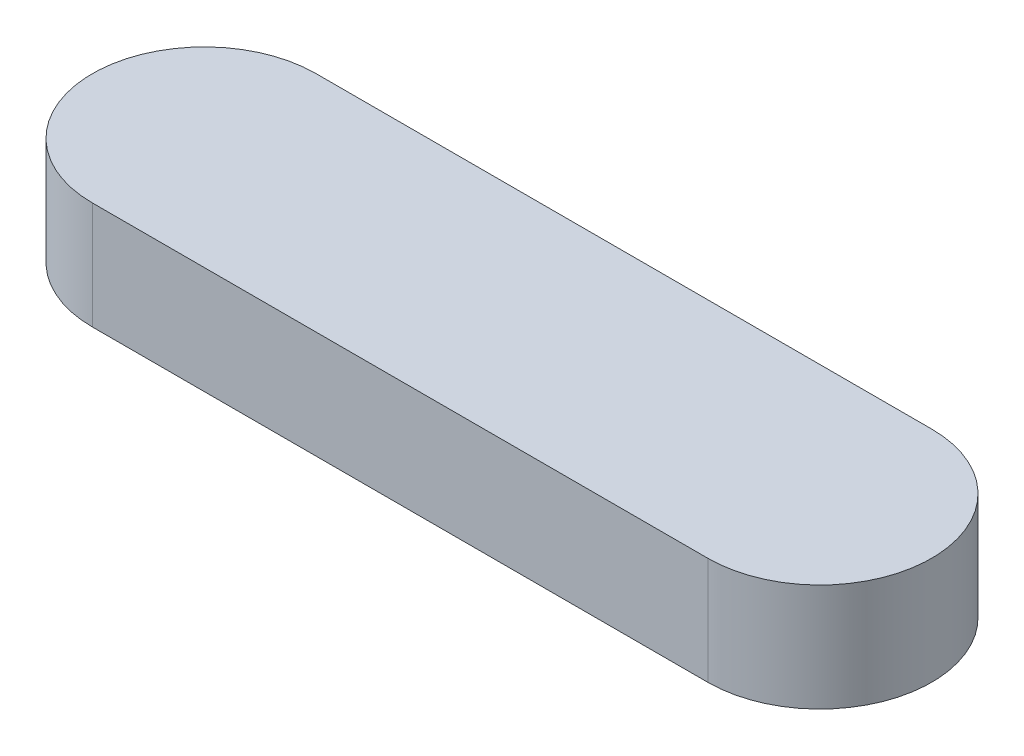
ISO-10303-21;
HEADER;
FILE_DESCRIPTION(('STEP AP214'),'2;1');
FILE_NAME('part.step','',(''),(''),'','','');
FILE_SCHEMA(('AUTOMOTIVE_DESIGN { 1 0 10303 214 1 1 1 1 }'));
ENDSEC;
DATA;
#1=APPLICATION_CONTEXT('core data for automotive mechanical design processes');
#2=APPLICATION_PROTOCOL_DEFINITION('international standard','automotive_design',2000,#1);
#3=PRODUCT_CONTEXT('',#1,'mechanical');
#4=PRODUCT('Part','Part','',(#3));
#5=PRODUCT_RELATED_PRODUCT_CATEGORY('part','',(#4));
#6=PRODUCT_DEFINITION_FORMATION('','',#4);
#7=PRODUCT_DEFINITION_CONTEXT('part definition',#1,'design');
#8=PRODUCT_DEFINITION('design','',#6,#7);
#9=PRODUCT_DEFINITION_SHAPE('','',#8);
#10=(LENGTH_UNIT() NAMED_UNIT(*) SI_UNIT(.MILLI.,.METRE.));
#11=(NAMED_UNIT(*) PLANE_ANGLE_UNIT() SI_UNIT($,.RADIAN.));
#12=(NAMED_UNIT(*) SI_UNIT($,.STERADIAN.) SOLID_ANGLE_UNIT());
#13=UNCERTAINTY_MEASURE_WITH_UNIT(LENGTH_MEASURE(1.E-05),#10,'distance_accuracy_value','');
#14=(GEOMETRIC_REPRESENTATION_CONTEXT(3) GLOBAL_UNCERTAINTY_ASSIGNED_CONTEXT((#13)) GLOBAL_UNIT_ASSIGNED_CONTEXT((#10,
#11,#12)) REPRESENTATION_CONTEXT('',''));
#15=CARTESIAN_POINT('',(0.,0.,0.));
#16=DIRECTION('',(0.,0.,1.));
#17=DIRECTION('',(1.,0.,0.));
#18=AXIS2_PLACEMENT_3D('',#15,#16,#17);
#19=CARTESIAN_POINT('',(11.,3.84,0.));
#20=DIRECTION('',(0.,-1.,0.));
#21=DIRECTION('',(0.,0.,-1.));
#22=AXIS2_PLACEMENT_3D('',#19,#20,#21);
#23=CYLINDRICAL_SURFACE('',#22,4.);
#24=CARTESIAN_POINT('',(11.,0.,0.));
#25=DIRECTION('',(0.,1.,0.));
#26=DIRECTION('',(0.,0.,1.));
#27=AXIS2_PLACEMENT_3D('',#24,#25,#26);
#28=CIRCLE('',#27,4.);
#29=CARTESIAN_POINT('',(11.,0.,4.));
#30=VERTEX_POINT('',#29);
#31=CARTESIAN_POINT('',(11.,0.,-4.));
#32=VERTEX_POINT('',#31);
#33=EDGE_CURVE('E102',#30,#32,#28,.T.);
#34=ORIENTED_EDGE('',*,*,#33,.T.);
#35=DIRECTION('',(0.,-1.,0.));
#36=VECTOR('',#35,1.);
#37=CARTESIAN_POINT('',(11.,3.84,-4.));
#38=LINE('',#37,#36);
#39=CARTESIAN_POINT('',(11.,3.84,-4.));
#40=VERTEX_POINT('',#39);
#41=EDGE_CURVE('E11',#40,#32,#38,.T.);
#42=ORIENTED_EDGE('',*,*,#41,.F.);
#43=CARTESIAN_POINT('',(11.,3.84,0.));
#44=DIRECTION('',(0.,1.,0.));
#45=DIRECTION('',(0.,0.,1.));
#46=AXIS2_PLACEMENT_3D('',#43,#44,#45);
#47=CIRCLE('',#46,4.);
#48=CARTESIAN_POINT('',(11.,3.84,4.));
#49=VERTEX_POINT('',#48);
#50=EDGE_CURVE('E90',#49,#40,#47,.T.);
#51=ORIENTED_EDGE('',*,*,#50,.F.);
#52=DIRECTION('',(0.,-1.,0.));
#53=VECTOR('',#52,1.);
#54=CARTESIAN_POINT('',(11.,3.84,4.));
#55=LINE('',#54,#53);
#56=EDGE_CURVE('E98',#49,#30,#55,.T.);
#57=ORIENTED_EDGE('',*,*,#56,.T.);
#58=EDGE_LOOP('',(#34,#42,#51,#57));
#59=FACE_BOUND('',#58,.T.);
#60=ADVANCED_FACE('F39',(#59),#23,.T.);
#61=CARTESIAN_POINT('',(11.,3.84,-4.));
#62=DIRECTION('',(0.,0.,1.));
#63=DIRECTION('',(1.,0.,0.));
#64=AXIS2_PLACEMENT_3D('',#61,#62,#63);
#65=PLANE('',#64);
#66=DIRECTION('',(-1.,0.,0.));
#67=VECTOR('',#66,1.);
#68=CARTESIAN_POINT('',(11.,0.,-4.));
#69=LINE('',#68,#67);
#70=CARTESIAN_POINT('',(-11.,0.,-4.));
#71=VERTEX_POINT('',#70);
#72=EDGE_CURVE('E94',#32,#71,#69,.T.);
#73=ORIENTED_EDGE('',*,*,#72,.T.);
#74=DIRECTION('',(0.,-1.,0.));
#75=VECTOR('',#74,1.);
#76=CARTESIAN_POINT('',(-11.,3.84,-4.));
#77=LINE('',#76,#75);
#78=CARTESIAN_POINT('',(-11.,3.84,-4.));
#79=VERTEX_POINT('',#78);
#80=EDGE_CURVE('E47',#79,#71,#77,.T.);
#81=ORIENTED_EDGE('',*,*,#80,.F.);
#82=DIRECTION('',(-1.,0.,0.));
#83=VECTOR('',#82,1.);
#84=CARTESIAN_POINT('',(11.,3.84,-4.));
#85=LINE('',#84,#83);
#86=EDGE_CURVE('E85',#40,#79,#85,.T.);
#87=ORIENTED_EDGE('',*,*,#86,.F.);
#88=ORIENTED_EDGE('',*,*,#41,.T.);
#89=EDGE_LOOP('',(#73,#81,#87,#88));
#90=FACE_BOUND('',#89,.T.);
#91=ADVANCED_FACE('F93',(#90),#65,.F.);
#92=CARTESIAN_POINT('',(-11.,3.84,0.));
#93=DIRECTION('',(0.,-1.,0.));
#94=DIRECTION('',(0.,0.,-1.));
#95=AXIS2_PLACEMENT_3D('',#92,#93,#94);
#96=CYLINDRICAL_SURFACE('',#95,4.);
#97=CARTESIAN_POINT('',(-11.,0.,0.));
#98=DIRECTION('',(0.,1.,0.));
#99=DIRECTION('',(0.,0.,1.));
#100=AXIS2_PLACEMENT_3D('',#97,#98,#99);
#101=CIRCLE('',#100,4.);
#102=CARTESIAN_POINT('',(-11.,0.,4.));
#103=VERTEX_POINT('',#102);
#104=EDGE_CURVE('E72',#71,#103,#101,.T.);
#105=ORIENTED_EDGE('',*,*,#104,.T.);
#106=DIRECTION('',(0.,-1.,0.));
#107=VECTOR('',#106,1.);
#108=CARTESIAN_POINT('',(-11.,3.84,4.));
#109=LINE('',#108,#107);
#110=CARTESIAN_POINT('',(-11.,3.84,4.));
#111=VERTEX_POINT('',#110);
#112=EDGE_CURVE('E95',#111,#103,#109,.T.);
#113=ORIENTED_EDGE('',*,*,#112,.F.);
#114=CARTESIAN_POINT('',(-11.,3.84,0.));
#115=DIRECTION('',(0.,1.,0.));
#116=DIRECTION('',(0.,0.,1.));
#117=AXIS2_PLACEMENT_3D('',#114,#115,#116);
#118=CIRCLE('',#117,4.);
#119=EDGE_CURVE('E88',#79,#111,#118,.T.);
#120=ORIENTED_EDGE('',*,*,#119,.F.);
#121=ORIENTED_EDGE('',*,*,#80,.T.);
#122=EDGE_LOOP('',(#105,#113,#120,#121));
#123=FACE_BOUND('',#122,.T.);
#124=ADVANCED_FACE('F96',(#123),#96,.T.);
#125=CARTESIAN_POINT('',(11.,3.84,4.));
#126=DIRECTION('',(0.,0.,-1.));
#127=DIRECTION('',(-1.,0.,0.));
#128=AXIS2_PLACEMENT_3D('',#125,#126,#127);
#129=PLANE('',#128);
#130=DIRECTION('',(1.,0.,0.));
#131=VECTOR('',#130,1.);
#132=CARTESIAN_POINT('',(11.,0.,4.));
#133=LINE('',#132,#131);
#134=EDGE_CURVE('E78',#103,#30,#133,.T.);
#135=ORIENTED_EDGE('',*,*,#134,.T.);
#136=ORIENTED_EDGE('',*,*,#56,.F.);
#137=DIRECTION('',(1.,0.,0.));
#138=VECTOR('',#137,1.);
#139=CARTESIAN_POINT('',(11.,3.84,4.));
#140=LINE('',#139,#138);
#141=EDGE_CURVE('E55',#111,#49,#140,.T.);
#142=ORIENTED_EDGE('',*,*,#141,.F.);
#143=ORIENTED_EDGE('',*,*,#112,.T.);
#144=EDGE_LOOP('',(#135,#136,#142,#143));
#145=FACE_BOUND('',#144,.T.);
#146=ADVANCED_FACE('F109',(#145),#129,.F.);
#147=CARTESIAN_POINT('',(11.,3.84,0.));
#148=DIRECTION('',(0.,1.,0.));
#149=DIRECTION('',(0.,0.,1.));
#150=AXIS2_PLACEMENT_3D('',#147,#148,#149);
#151=PLANE('',#150);
#152=ORIENTED_EDGE('',*,*,#50,.T.);
#153=ORIENTED_EDGE('',*,*,#86,.T.);
#154=ORIENTED_EDGE('',*,*,#119,.T.);
#155=ORIENTED_EDGE('',*,*,#141,.T.);
#156=EDGE_LOOP('',(#152,#153,#154,#155));
#157=FACE_BOUND('',#156,.T.);
#158=ADVANCED_FACE('F86',(#157),#151,.T.);
#159=CARTESIAN_POINT('',(11.,0.,0.));
#160=DIRECTION('',(0.,1.,0.));
#161=DIRECTION('',(0.,0.,1.));
#162=AXIS2_PLACEMENT_3D('',#159,#160,#161);
#163=PLANE('',#162);
#164=ORIENTED_EDGE('',*,*,#33,.F.);
#165=ORIENTED_EDGE('',*,*,#134,.F.);
#166=ORIENTED_EDGE('',*,*,#104,.F.);
#167=ORIENTED_EDGE('',*,*,#72,.F.);
#168=EDGE_LOOP('',(#164,#165,#166,#167));
#169=FACE_BOUND('',#168,.T.);
#170=ADVANCED_FACE('F112',(#169),#163,.F.);
#171=CLOSED_SHELL('',(#60,#91,#124,#146,#158,#170));
#172=MANIFOLD_SOLID_BREP('B2',#171);
#173=ADVANCED_BREP_SHAPE_REPRESENTATION('',(#18,#172),#14);
#174=SHAPE_DEFINITION_REPRESENTATION(#9,#173);
ENDSEC;
END-ISO-10303-21;
